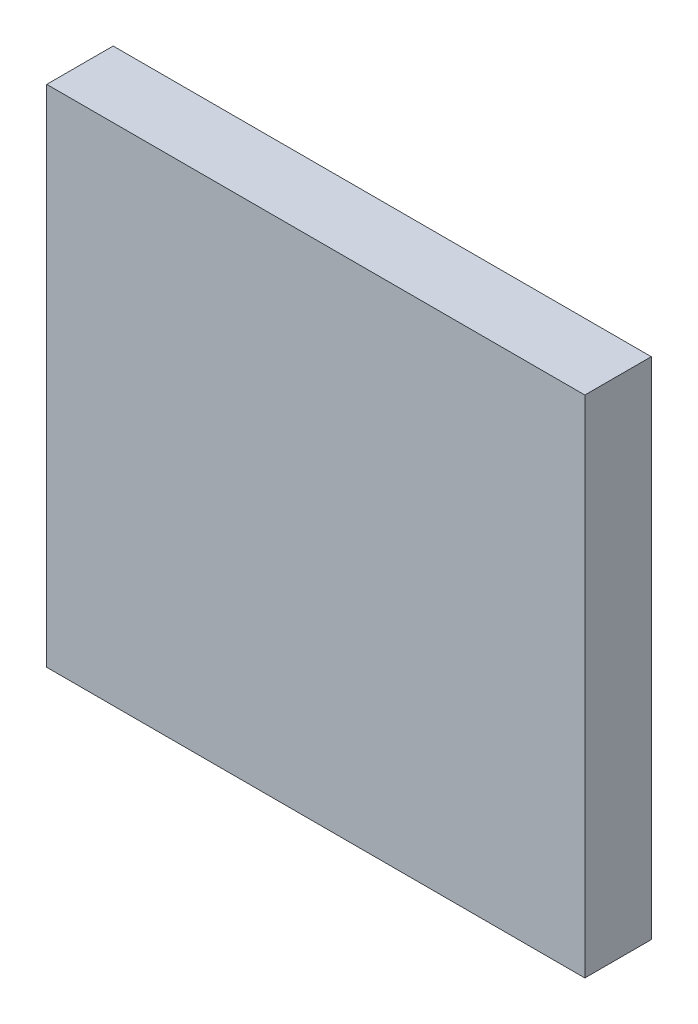
ISO-10303-21;
HEADER;
FILE_DESCRIPTION(('STEP AP214'),'2;1');
FILE_NAME('part.step','',(''),(''),'','','');
FILE_SCHEMA(('AUTOMOTIVE_DESIGN { 1 0 10303 214 1 1 1 1 }'));
ENDSEC;
DATA;
#1=APPLICATION_CONTEXT('core data for automotive mechanical design processes');
#2=APPLICATION_PROTOCOL_DEFINITION('international standard','automotive_design',2000,#1);
#3=PRODUCT_CONTEXT('',#1,'mechanical');
#4=PRODUCT('Part','Part','',(#3));
#5=PRODUCT_RELATED_PRODUCT_CATEGORY('part','',(#4));
#6=PRODUCT_DEFINITION_FORMATION('','',#4);
#7=PRODUCT_DEFINITION_CONTEXT('part definition',#1,'design');
#8=PRODUCT_DEFINITION('design','',#6,#7);
#9=PRODUCT_DEFINITION_SHAPE('','',#8);
#10=(LENGTH_UNIT() NAMED_UNIT(*) SI_UNIT(.MILLI.,.METRE.));
#11=(NAMED_UNIT(*) PLANE_ANGLE_UNIT() SI_UNIT($,.RADIAN.));
#12=(NAMED_UNIT(*) SI_UNIT($,.STERADIAN.) SOLID_ANGLE_UNIT());
#13=UNCERTAINTY_MEASURE_WITH_UNIT(LENGTH_MEASURE(1.E-05),#10,'distance_accuracy_value','');
#14=(GEOMETRIC_REPRESENTATION_CONTEXT(3) GLOBAL_UNCERTAINTY_ASSIGNED_CONTEXT((#13)) GLOBAL_UNIT_ASSIGNED_CONTEXT((#10,
#11,#12)) REPRESENTATION_CONTEXT('',''));
#15=CARTESIAN_POINT('',(0.,0.,0.));
#16=DIRECTION('',(0.,0.,1.));
#17=DIRECTION('',(1.,0.,0.));
#18=AXIS2_PLACEMENT_3D('',#15,#16,#17);
#19=CARTESIAN_POINT('',(-4.1016,-4.6016,1.));
#20=DIRECTION('',(1.,0.,0.));
#21=DIRECTION('',(0.,0.,-1.));
#22=AXIS2_PLACEMENT_3D('',#19,#20,#21);
#23=PLANE('',#22);
#24=DIRECTION('',(0.,-1.,0.));
#25=VECTOR('',#24,1.);
#26=CARTESIAN_POINT('',(-4.1016,-4.6016,0.));
#27=LINE('',#26,#25);
#28=CARTESIAN_POINT('',(-4.1016,3.,0.));
#29=VERTEX_POINT('',#28);
#30=CARTESIAN_POINT('',(-4.1016,-4.6016,0.));
#31=VERTEX_POINT('',#30);
#32=EDGE_CURVE('E95',#29,#31,#27,.T.);
#33=ORIENTED_EDGE('',*,*,#32,.T.);
#34=DIRECTION('',(0.,0.,-1.));
#35=VECTOR('',#34,1.);
#36=CARTESIAN_POINT('',(-4.1016,-4.6016,1.));
#37=LINE('',#36,#35);
#38=CARTESIAN_POINT('',(-4.1016,-4.6016,1.));
#39=VERTEX_POINT('',#38);
#40=EDGE_CURVE('E11',#39,#31,#37,.T.);
#41=ORIENTED_EDGE('',*,*,#40,.F.);
#42=DIRECTION('',(0.,-1.,0.));
#43=VECTOR('',#42,1.);
#44=CARTESIAN_POINT('',(-4.1016,-4.6016,1.));
#45=LINE('',#44,#43);
#46=CARTESIAN_POINT('',(-4.1016,3.,1.));
#47=VERTEX_POINT('',#46);
#48=EDGE_CURVE('E83',#47,#39,#45,.T.);
#49=ORIENTED_EDGE('',*,*,#48,.F.);
#50=DIRECTION('',(0.,0.,-1.));
#51=VECTOR('',#50,1.);
#52=CARTESIAN_POINT('',(-4.1016,3.,1.));
#53=LINE('',#52,#51);
#54=EDGE_CURVE('E91',#47,#29,#53,.T.);
#55=ORIENTED_EDGE('',*,*,#54,.T.);
#56=EDGE_LOOP('',(#33,#41,#49,#55));
#57=FACE_BOUND('',#56,.T.);
#58=ADVANCED_FACE('F32',(#57),#23,.F.);
#59=CARTESIAN_POINT('',(4.,-4.6016,1.));
#60=DIRECTION('',(0.,1.,0.));
#61=DIRECTION('',(0.,0.,1.));
#62=AXIS2_PLACEMENT_3D('',#59,#60,#61);
#63=PLANE('',#62);
#64=DIRECTION('',(1.,0.,0.));
#65=VECTOR('',#64,1.);
#66=CARTESIAN_POINT('',(4.,-4.6016,0.));
#67=LINE('',#66,#65);
#68=CARTESIAN_POINT('',(4.,-4.6016,0.));
#69=VERTEX_POINT('',#68);
#70=EDGE_CURVE('E87',#31,#69,#67,.T.);
#71=ORIENTED_EDGE('',*,*,#70,.T.);
#72=DIRECTION('',(0.,0.,-1.));
#73=VECTOR('',#72,1.);
#74=CARTESIAN_POINT('',(4.,-4.6016,1.));
#75=LINE('',#74,#73);
#76=CARTESIAN_POINT('',(4.,-4.6016,1.));
#77=VERTEX_POINT('',#76);
#78=EDGE_CURVE('E40',#77,#69,#75,.T.);
#79=ORIENTED_EDGE('',*,*,#78,.F.);
#80=DIRECTION('',(1.,0.,0.));
#81=VECTOR('',#80,1.);
#82=CARTESIAN_POINT('',(4.,-4.6016,1.));
#83=LINE('',#82,#81);
#84=EDGE_CURVE('E78',#39,#77,#83,.T.);
#85=ORIENTED_EDGE('',*,*,#84,.F.);
#86=ORIENTED_EDGE('',*,*,#40,.T.);
#87=EDGE_LOOP('',(#71,#79,#85,#86));
#88=FACE_BOUND('',#87,.T.);
#89=ADVANCED_FACE('F86',(#88),#63,.F.);
#90=CARTESIAN_POINT('',(4.,3.,1.));
#91=DIRECTION('',(-1.,0.,0.));
#92=DIRECTION('',(0.,0.,1.));
#93=AXIS2_PLACEMENT_3D('',#90,#91,#92);
#94=PLANE('',#93);
#95=DIRECTION('',(0.,1.,0.));
#96=VECTOR('',#95,1.);
#97=CARTESIAN_POINT('',(4.,3.,0.));
#98=LINE('',#97,#96);
#99=CARTESIAN_POINT('',(4.,3.,0.));
#100=VERTEX_POINT('',#99);
#101=EDGE_CURVE('E65',#69,#100,#98,.T.);
#102=ORIENTED_EDGE('',*,*,#101,.T.);
#103=DIRECTION('',(0.,0.,-1.));
#104=VECTOR('',#103,1.);
#105=CARTESIAN_POINT('',(4.,3.,1.));
#106=LINE('',#105,#104);
#107=CARTESIAN_POINT('',(4.,3.,1.));
#108=VERTEX_POINT('',#107);
#109=EDGE_CURVE('E88',#108,#100,#106,.T.);
#110=ORIENTED_EDGE('',*,*,#109,.F.);
#111=DIRECTION('',(0.,1.,0.));
#112=VECTOR('',#111,1.);
#113=CARTESIAN_POINT('',(4.,3.,1.));
#114=LINE('',#113,#112);
#115=EDGE_CURVE('E81',#77,#108,#114,.T.);
#116=ORIENTED_EDGE('',*,*,#115,.F.);
#117=ORIENTED_EDGE('',*,*,#78,.T.);
#118=EDGE_LOOP('',(#102,#110,#116,#117));
#119=FACE_BOUND('',#118,.T.);
#120=ADVANCED_FACE('F89',(#119),#94,.F.);
#121=CARTESIAN_POINT('',(-4.1016,3.,1.));
#122=DIRECTION('',(0.,-1.,0.));
#123=DIRECTION('',(0.,0.,-1.));
#124=AXIS2_PLACEMENT_3D('',#121,#122,#123);
#125=PLANE('',#124);
#126=DIRECTION('',(-1.,0.,0.));
#127=VECTOR('',#126,1.);
#128=CARTESIAN_POINT('',(-4.1016,3.,0.));
#129=LINE('',#128,#127);
#130=EDGE_CURVE('E71',#100,#29,#129,.T.);
#131=ORIENTED_EDGE('',*,*,#130,.T.);
#132=ORIENTED_EDGE('',*,*,#54,.F.);
#133=DIRECTION('',(-1.,0.,0.));
#134=VECTOR('',#133,1.);
#135=CARTESIAN_POINT('',(-4.1016,3.,1.));
#136=LINE('',#135,#134);
#137=EDGE_CURVE('E48',#108,#47,#136,.T.);
#138=ORIENTED_EDGE('',*,*,#137,.F.);
#139=ORIENTED_EDGE('',*,*,#109,.T.);
#140=EDGE_LOOP('',(#131,#132,#138,#139));
#141=FACE_BOUND('',#140,.T.);
#142=ADVANCED_FACE('F102',(#141),#125,.F.);
#143=CARTESIAN_POINT('',(0.,0.,1.));
#144=DIRECTION('',(0.,0.,-1.));
#145=DIRECTION('',(-1.,0.,0.));
#146=AXIS2_PLACEMENT_3D('',#143,#144,#145);
#147=PLANE('',#146);
#148=ORIENTED_EDGE('',*,*,#48,.T.);
#149=ORIENTED_EDGE('',*,*,#84,.T.);
#150=ORIENTED_EDGE('',*,*,#115,.T.);
#151=ORIENTED_EDGE('',*,*,#137,.T.);
#152=EDGE_LOOP('',(#148,#149,#150,#151));
#153=FACE_BOUND('',#152,.T.);
#154=ADVANCED_FACE('F79',(#153),#147,.F.);
#155=CARTESIAN_POINT('',(0.,0.,0.));
#156=DIRECTION('',(0.,0.,-1.));
#157=DIRECTION('',(-1.,0.,0.));
#158=AXIS2_PLACEMENT_3D('',#155,#156,#157);
#159=PLANE('',#158);
#160=ORIENTED_EDGE('',*,*,#32,.F.);
#161=ORIENTED_EDGE('',*,*,#130,.F.);
#162=ORIENTED_EDGE('',*,*,#101,.F.);
#163=ORIENTED_EDGE('',*,*,#70,.F.);
#164=EDGE_LOOP('',(#160,#161,#162,#163));
#165=FACE_BOUND('',#164,.T.);
#166=ADVANCED_FACE('F105',(#165),#159,.T.);
#167=CLOSED_SHELL('',(#58,#89,#120,#142,#154,#166));
#168=MANIFOLD_SOLID_BREP('B2',#167);
#169=ADVANCED_BREP_SHAPE_REPRESENTATION('',(#18,#168),#14);
#170=SHAPE_DEFINITION_REPRESENTATION(#9,#169);
ENDSEC;
END-ISO-10303-21;
